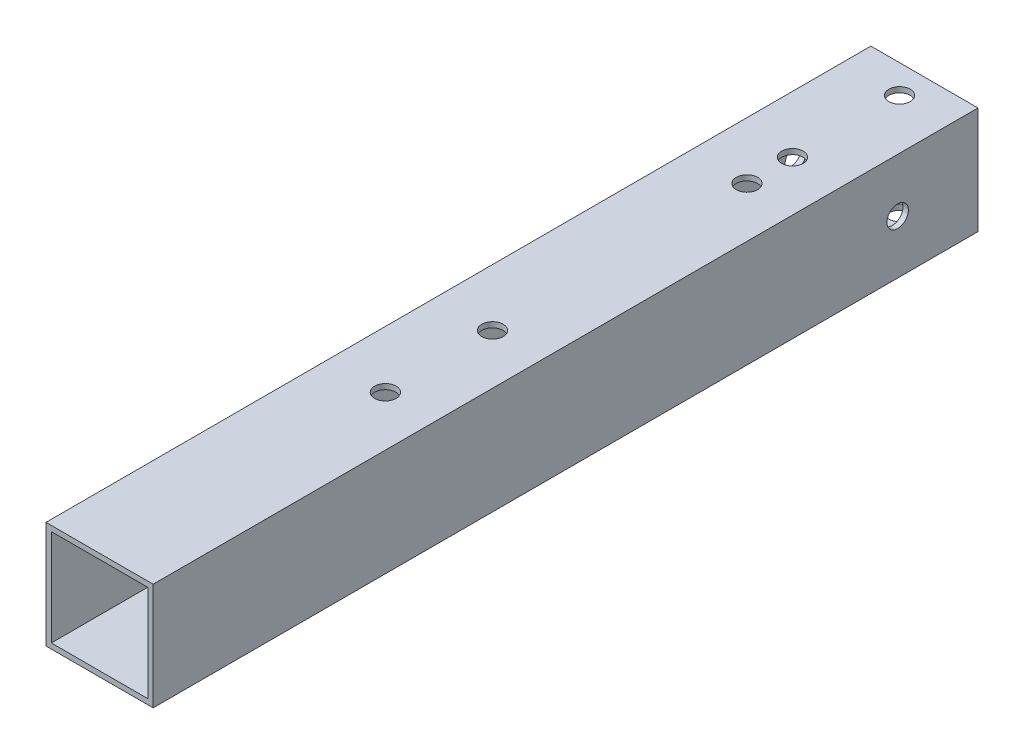
ISO-10303-21;
HEADER;
FILE_DESCRIPTION(('STEP AP214'),'2;1');
FILE_NAME('part.step','',(''),(''),'','','');
FILE_SCHEMA(('AUTOMOTIVE_DESIGN { 1 0 10303 214 1 1 1 1 }'));
ENDSEC;
DATA;
#1=APPLICATION_CONTEXT('core data for automotive mechanical design processes');
#2=APPLICATION_PROTOCOL_DEFINITION('international standard','automotive_design',2000,#1);
#3=PRODUCT_CONTEXT('',#1,'mechanical');
#4=PRODUCT('Part','Part','',(#3));
#5=PRODUCT_RELATED_PRODUCT_CATEGORY('part','',(#4));
#6=PRODUCT_DEFINITION_FORMATION('','',#4);
#7=PRODUCT_DEFINITION_CONTEXT('part definition',#1,'design');
#8=PRODUCT_DEFINITION('design','',#6,#7);
#9=PRODUCT_DEFINITION_SHAPE('','',#8);
#10=(LENGTH_UNIT() NAMED_UNIT(*) SI_UNIT(.MILLI.,.METRE.));
#11=(NAMED_UNIT(*) PLANE_ANGLE_UNIT() SI_UNIT($,.RADIAN.));
#12=(NAMED_UNIT(*) SI_UNIT($,.STERADIAN.) SOLID_ANGLE_UNIT());
#13=UNCERTAINTY_MEASURE_WITH_UNIT(LENGTH_MEASURE(1.E-05),#10,'distance_accuracy_value','');
#14=(GEOMETRIC_REPRESENTATION_CONTEXT(3) GLOBAL_UNCERTAINTY_ASSIGNED_CONTEXT((#13)) GLOBAL_UNIT_ASSIGNED_CONTEXT((#10,
#11,#12)) REPRESENTATION_CONTEXT('',''));
#15=CARTESIAN_POINT('',(0.,0.,0.));
#16=DIRECTION('',(0.,0.,1.));
#17=DIRECTION('',(1.,0.,0.));
#18=AXIS2_PLACEMENT_3D('',#15,#16,#17);
#19=CARTESIAN_POINT('',(0.,0.,83.5));
#20=DIRECTION('',(0.,0.,1.));
#21=DIRECTION('',(1.,0.,0.));
#22=AXIS2_PLACEMENT_3D('',#19,#20,#21);
#23=PLANE('',#22);
#24=DIRECTION('',(0.,1.,0.));
#25=VECTOR('',#24,1.);
#26=CARTESIAN_POINT('',(10.,10.,83.5));
#27=LINE('',#26,#25);
#28=CARTESIAN_POINT('',(10.,-10.,83.5));
#29=VERTEX_POINT('',#28);
#30=CARTESIAN_POINT('',(10.,10.,83.5));
#31=VERTEX_POINT('',#30);
#32=EDGE_CURVE('E205',#29,#31,#27,.T.);
#33=ORIENTED_EDGE('',*,*,#32,.T.);
#34=DIRECTION('',(-1.,0.,0.));
#35=VECTOR('',#34,1.);
#36=CARTESIAN_POINT('',(-10.,10.,83.5));
#37=LINE('',#36,#35);
#38=CARTESIAN_POINT('',(-10.,10.,83.5));
#39=VERTEX_POINT('',#38);
#40=EDGE_CURVE('E209',#31,#39,#37,.T.);
#41=ORIENTED_EDGE('',*,*,#40,.T.);
#42=DIRECTION('',(0.,-1.,0.));
#43=VECTOR('',#42,1.);
#44=CARTESIAN_POINT('',(-10.,10.,83.5));
#45=LINE('',#44,#43);
#46=CARTESIAN_POINT('',(-9.99999999999999,-10.,83.5));
#47=VERTEX_POINT('',#46);
#48=EDGE_CURVE('E127',#39,#47,#45,.T.);
#49=ORIENTED_EDGE('',*,*,#48,.T.);
#50=DIRECTION('',(1.,0.,0.));
#51=VECTOR('',#50,1.);
#52=CARTESIAN_POINT('',(-9.99999999999999,-10.,83.5));
#53=LINE('',#52,#51);
#54=EDGE_CURVE('E214',#47,#29,#53,.T.);
#55=ORIENTED_EDGE('',*,*,#54,.T.);
#56=EDGE_LOOP('',(#33,#41,#49,#55));
#57=FACE_BOUND('',#56,.T.);
#58=DIRECTION('',(-1.,0.,0.));
#59=VECTOR('',#58,1.);
#60=CARTESIAN_POINT('',(-9.00000000000001,9.,83.5));
#61=LINE('',#60,#59);
#62=CARTESIAN_POINT('',(9.,9.,83.5));
#63=VERTEX_POINT('',#62);
#64=CARTESIAN_POINT('',(-9.00000000000001,9.,83.5));
#65=VERTEX_POINT('',#64);
#66=EDGE_CURVE('E179',#63,#65,#61,.T.);
#67=ORIENTED_EDGE('',*,*,#66,.F.);
#68=DIRECTION('',(0.,1.,0.));
#69=VECTOR('',#68,1.);
#70=CARTESIAN_POINT('',(9.,9.,83.5));
#71=LINE('',#70,#69);
#72=CARTESIAN_POINT('',(9.,-9.,83.5));
#73=VERTEX_POINT('',#72);
#74=EDGE_CURVE('E168',#73,#63,#71,.T.);
#75=ORIENTED_EDGE('',*,*,#74,.F.);
#76=DIRECTION('',(1.,0.,0.));
#77=VECTOR('',#76,1.);
#78=CARTESIAN_POINT('',(-9.00000000000001,-9.,83.5));
#79=LINE('',#78,#77);
#80=CARTESIAN_POINT('',(-9.00000000000001,-9.,83.5));
#81=VERTEX_POINT('',#80);
#82=EDGE_CURVE('E186',#81,#73,#79,.T.);
#83=ORIENTED_EDGE('',*,*,#82,.F.);
#84=DIRECTION('',(0.,-1.,0.));
#85=VECTOR('',#84,1.);
#86=CARTESIAN_POINT('',(-9.00000000000001,9.,83.5));
#87=LINE('',#86,#85);
#88=EDGE_CURVE('E182',#65,#81,#87,.T.);
#89=ORIENTED_EDGE('',*,*,#88,.F.);
#90=EDGE_LOOP('',(#67,#75,#83,#89));
#91=FACE_BOUND('',#90,.T.);
#92=ADVANCED_FACE('F42',(#57,#91),#23,.T.);
#93=CARTESIAN_POINT('',(10.,10.,83.5));
#94=DIRECTION('',(-1.,0.,0.));
#95=DIRECTION('',(0.,-1.,0.));
#96=AXIS2_PLACEMENT_3D('',#93,#94,#95);
#97=PLANE('',#96);
#98=CARTESIAN_POINT('',(10.,0.,-55.5));
#99=DIRECTION('',(1.,0.,0.));
#100=DIRECTION('',(0.,1.,0.));
#101=AXIS2_PLACEMENT_3D('',#98,#99,#100);
#102=CIRCLE('',#101,2.);
#103=CARTESIAN_POINT('',(10.,2.,-55.5));
#104=VERTEX_POINT('',#103);
#105=EDGE_CURVE('E546',#104,#104,#102,.T.);
#106=ORIENTED_EDGE('',*,*,#105,.F.);
#107=EDGE_LOOP('',(#106));
#108=FACE_BOUND('',#107,.T.);
#109=DIRECTION('',(0.,0.,-1.));
#110=VECTOR('',#109,1.);
#111=CARTESIAN_POINT('',(10.,-10.,83.5));
#112=LINE('',#111,#110);
#113=CARTESIAN_POINT('',(10.,-10.,-70.4999999999999));
#114=VERTEX_POINT('',#113);
#115=EDGE_CURVE('E134',#29,#114,#112,.T.);
#116=ORIENTED_EDGE('',*,*,#115,.T.);
#117=DIRECTION('',(0.,-1.,0.));
#118=VECTOR('',#117,1.);
#119=CARTESIAN_POINT('',(10.,-10.,-70.5));
#120=LINE('',#119,#118);
#121=CARTESIAN_POINT('',(10.,10.,-70.5));
#122=VERTEX_POINT('',#121);
#123=EDGE_CURVE('E59',#122,#114,#120,.T.);
#124=ORIENTED_EDGE('',*,*,#123,.F.);
#125=DIRECTION('',(0.,0.,-1.));
#126=VECTOR('',#125,1.);
#127=CARTESIAN_POINT('',(10.,10.,83.5));
#128=LINE('',#127,#126);
#129=EDGE_CURVE('E52',#31,#122,#128,.T.);
#130=ORIENTED_EDGE('',*,*,#129,.F.);
#131=ORIENTED_EDGE('',*,*,#32,.F.);
#132=EDGE_LOOP('',(#116,#124,#130,#131));
#133=FACE_BOUND('',#132,.T.);
#134=ADVANCED_FACE('F44',(#108,#133),#97,.F.);
#135=CARTESIAN_POINT('',(-10.,10.,83.5));
#136=DIRECTION('',(0.,-1.,0.));
#137=DIRECTION('',(1.,0.,0.));
#138=AXIS2_PLACEMENT_3D('',#135,#136,#137);
#139=PLANE('',#138);
#140=CARTESIAN_POINT('',(0.645896247201713,10.,30.7887288873649));
#141=DIRECTION('',(0.,1.,0.));
#142=DIRECTION('',(0.,0.,1.));
#143=AXIS2_PLACEMENT_3D('',#140,#141,#142);
#144=CIRCLE('',#143,2.);
#145=CARTESIAN_POINT('',(0.645896247201713,10.,32.7887288873649));
#146=VERTEX_POINT('',#145);
#147=EDGE_CURVE('E237',#146,#146,#144,.T.);
#148=ORIENTED_EDGE('',*,*,#147,.F.);
#149=EDGE_LOOP('',(#148));
#150=FACE_BOUND('',#149,.T.);
#151=CARTESIAN_POINT('',(0.645896247201712,10.,10.7887288873649));
#152=DIRECTION('',(0.,1.,0.));
#153=DIRECTION('',(0.,0.,1.));
#154=AXIS2_PLACEMENT_3D('',#151,#152,#153);
#155=CIRCLE('',#154,2.);
#156=CARTESIAN_POINT('',(0.645896247201712,10.,12.7887288873649));
#157=VERTEX_POINT('',#156);
#158=EDGE_CURVE('E241',#157,#157,#155,.T.);
#159=ORIENTED_EDGE('',*,*,#158,.F.);
#160=EDGE_LOOP('',(#159));
#161=FACE_BOUND('',#160,.T.);
#162=CARTESIAN_POINT('',(0.64589624720171,10.,-36.7112711126351));
#163=DIRECTION('',(0.,1.,0.));
#164=DIRECTION('',(0.,0.,1.));
#165=AXIS2_PLACEMENT_3D('',#162,#163,#164);
#166=CIRCLE('',#165,2.);
#167=CARTESIAN_POINT('',(0.64589624720171,10.,-34.7112711126351));
#168=VERTEX_POINT('',#167);
#169=EDGE_CURVE('E249',#168,#168,#166,.T.);
#170=ORIENTED_EDGE('',*,*,#169,.F.);
#171=EDGE_LOOP('',(#170));
#172=FACE_BOUND('',#171,.T.);
#173=CARTESIAN_POINT('',(0.645896247201709,10.,-45.2112711126351));
#174=DIRECTION('',(0.,1.,0.));
#175=DIRECTION('',(0.,0.,1.));
#176=AXIS2_PLACEMENT_3D('',#173,#174,#175);
#177=CIRCLE('',#176,2.);
#178=CARTESIAN_POINT('',(0.645896247201709,10.,-43.2112711126351));
#179=VERTEX_POINT('',#178);
#180=EDGE_CURVE('E257',#179,#179,#177,.T.);
#181=ORIENTED_EDGE('',*,*,#180,.F.);
#182=EDGE_LOOP('',(#181));
#183=FACE_BOUND('',#182,.T.);
#184=CARTESIAN_POINT('',(0.645896247201708,10.,-65.2112711126351));
#185=DIRECTION('',(0.,1.,0.));
#186=DIRECTION('',(0.,0.,1.));
#187=AXIS2_PLACEMENT_3D('',#184,#185,#186);
#188=CIRCLE('',#187,2.);
#189=CARTESIAN_POINT('',(0.645896247201708,10.,-63.2112711126351));
#190=VERTEX_POINT('',#189);
#191=EDGE_CURVE('E265',#190,#190,#188,.T.);
#192=ORIENTED_EDGE('',*,*,#191,.F.);
#193=EDGE_LOOP('',(#192));
#194=FACE_BOUND('',#193,.T.);
#195=ORIENTED_EDGE('',*,*,#129,.T.);
#196=DIRECTION('',(1.,0.,0.));
#197=VECTOR('',#196,1.);
#198=CARTESIAN_POINT('',(-10.,10.,-70.5));
#199=LINE('',#198,#197);
#200=CARTESIAN_POINT('',(-10.,10.,-70.5));
#201=VERTEX_POINT('',#200);
#202=EDGE_CURVE('E109',#201,#122,#199,.T.);
#203=ORIENTED_EDGE('',*,*,#202,.F.);
#204=DIRECTION('',(0.,0.,-1.));
#205=VECTOR('',#204,1.);
#206=CARTESIAN_POINT('',(-10.,10.,83.5));
#207=LINE('',#206,#205);
#208=EDGE_CURVE('E121',#39,#201,#207,.T.);
#209=ORIENTED_EDGE('',*,*,#208,.F.);
#210=ORIENTED_EDGE('',*,*,#40,.F.);
#211=EDGE_LOOP('',(#195,#203,#209,#210));
#212=FACE_BOUND('',#211,.T.);
#213=ADVANCED_FACE('F120',(#150,#161,#172,#183,#194,#212),#139,.F.);
#214=CARTESIAN_POINT('',(-10.,10.,83.5));
#215=DIRECTION('',(1.,0.,0.));
#216=DIRECTION('',(0.,1.,0.));
#217=AXIS2_PLACEMENT_3D('',#214,#215,#216);
#218=PLANE('',#217);
#219=CARTESIAN_POINT('',(-10.,0.,-55.5));
#220=DIRECTION('',(1.,0.,0.));
#221=DIRECTION('',(0.,1.,0.));
#222=AXIS2_PLACEMENT_3D('',#219,#220,#221);
#223=CIRCLE('',#222,2.);
#224=CARTESIAN_POINT('',(-10.,2.,-55.5));
#225=VERTEX_POINT('',#224);
#226=EDGE_CURVE('E548',#225,#225,#223,.T.);
#227=ORIENTED_EDGE('',*,*,#226,.T.);
#228=EDGE_LOOP('',(#227));
#229=FACE_BOUND('',#228,.T.);
#230=ORIENTED_EDGE('',*,*,#208,.T.);
#231=DIRECTION('',(0.,-1.,0.));
#232=VECTOR('',#231,1.);
#233=CARTESIAN_POINT('',(-10.,-10.,-70.5));
#234=LINE('',#233,#232);
#235=CARTESIAN_POINT('',(-10.,-10.,-70.5));
#236=VERTEX_POINT('',#235);
#237=EDGE_CURVE('E106',#201,#236,#234,.T.);
#238=ORIENTED_EDGE('',*,*,#237,.T.);
#239=DIRECTION('',(0.,0.,-1.));
#240=VECTOR('',#239,1.);
#241=CARTESIAN_POINT('',(-9.99999999999999,-10.,83.5));
#242=LINE('',#241,#240);
#243=EDGE_CURVE('E129',#47,#236,#242,.T.);
#244=ORIENTED_EDGE('',*,*,#243,.F.);
#245=ORIENTED_EDGE('',*,*,#48,.F.);
#246=EDGE_LOOP('',(#230,#238,#244,#245));
#247=FACE_BOUND('',#246,.T.);
#248=ADVANCED_FACE('F126',(#229,#247),#218,.F.);
#249=CARTESIAN_POINT('',(-9.99999999999999,-10.,83.5));
#250=DIRECTION('',(0.,1.,0.));
#251=DIRECTION('',(-1.,0.,0.));
#252=AXIS2_PLACEMENT_3D('',#249,#250,#251);
#253=PLANE('',#252);
#254=CARTESIAN_POINT('',(0.645896247201713,-10.,30.7887288873649));
#255=DIRECTION('',(0.,1.,0.));
#256=DIRECTION('',(0.,0.,1.));
#257=AXIS2_PLACEMENT_3D('',#254,#255,#256);
#258=CIRCLE('',#257,2.);
#259=CARTESIAN_POINT('',(0.645896247201713,-10.,32.7887288873649));
#260=VERTEX_POINT('',#259);
#261=EDGE_CURVE('E143',#260,#260,#258,.T.);
#262=ORIENTED_EDGE('',*,*,#261,.T.);
#263=EDGE_LOOP('',(#262));
#264=FACE_BOUND('',#263,.T.);
#265=CARTESIAN_POINT('',(0.645896247201712,-10.,10.7887288873649));
#266=DIRECTION('',(0.,1.,0.));
#267=DIRECTION('',(0.,0.,1.));
#268=AXIS2_PLACEMENT_3D('',#265,#266,#267);
#269=CIRCLE('',#268,2.);
#270=CARTESIAN_POINT('',(0.645896247201712,-10.,12.7887288873649));
#271=VERTEX_POINT('',#270);
#272=EDGE_CURVE('E245',#271,#271,#269,.T.);
#273=ORIENTED_EDGE('',*,*,#272,.T.);
#274=EDGE_LOOP('',(#273));
#275=FACE_BOUND('',#274,.T.);
#276=CARTESIAN_POINT('',(0.64589624720171,-10.,-36.7112711126351));
#277=DIRECTION('',(0.,1.,0.));
#278=DIRECTION('',(0.,0.,1.));
#279=AXIS2_PLACEMENT_3D('',#276,#277,#278);
#280=CIRCLE('',#279,2.);
#281=CARTESIAN_POINT('',(0.64589624720171,-10.,-34.7112711126351));
#282=VERTEX_POINT('',#281);
#283=EDGE_CURVE('E253',#282,#282,#280,.T.);
#284=ORIENTED_EDGE('',*,*,#283,.T.);
#285=EDGE_LOOP('',(#284));
#286=FACE_BOUND('',#285,.T.);
#287=CARTESIAN_POINT('',(0.645896247201709,-10.,-45.2112711126351));
#288=DIRECTION('',(0.,1.,0.));
#289=DIRECTION('',(0.,0.,1.));
#290=AXIS2_PLACEMENT_3D('',#287,#288,#289);
#291=CIRCLE('',#290,2.);
#292=CARTESIAN_POINT('',(0.645896247201709,-10.,-43.2112711126351));
#293=VERTEX_POINT('',#292);
#294=EDGE_CURVE('E261',#293,#293,#291,.T.);
#295=ORIENTED_EDGE('',*,*,#294,.T.);
#296=EDGE_LOOP('',(#295));
#297=FACE_BOUND('',#296,.T.);
#298=CARTESIAN_POINT('',(0.645896247201708,-10.,-65.2112711126351));
#299=DIRECTION('',(0.,1.,0.));
#300=DIRECTION('',(0.,0.,1.));
#301=AXIS2_PLACEMENT_3D('',#298,#299,#300);
#302=CIRCLE('',#301,2.);
#303=CARTESIAN_POINT('',(0.645896247201708,-10.,-63.2112711126351));
#304=VERTEX_POINT('',#303);
#305=EDGE_CURVE('E236',#304,#304,#302,.T.);
#306=ORIENTED_EDGE('',*,*,#305,.T.);
#307=EDGE_LOOP('',(#306));
#308=FACE_BOUND('',#307,.T.);
#309=ORIENTED_EDGE('',*,*,#243,.T.);
#310=DIRECTION('',(1.,0.,0.));
#311=VECTOR('',#310,1.);
#312=CARTESIAN_POINT('',(-10.,-10.,-70.5));
#313=LINE('',#312,#311);
#314=EDGE_CURVE('E110',#236,#114,#313,.T.);
#315=ORIENTED_EDGE('',*,*,#314,.T.);
#316=ORIENTED_EDGE('',*,*,#115,.F.);
#317=ORIENTED_EDGE('',*,*,#54,.F.);
#318=EDGE_LOOP('',(#309,#315,#316,#317));
#319=FACE_BOUND('',#318,.T.);
#320=ADVANCED_FACE('F223',(#264,#275,#286,#297,#308,#319),#253,.F.);
#321=CARTESIAN_POINT('',(9.,9.,83.5));
#322=DIRECTION('',(-1.,0.,0.));
#323=DIRECTION('',(0.,0.,1.));
#324=AXIS2_PLACEMENT_3D('',#321,#322,#323);
#325=PLANE('',#324);
#326=CARTESIAN_POINT('',(9.,0.,-55.5));
#327=DIRECTION('',(-1.,0.,0.));
#328=DIRECTION('',(0.,0.,1.));
#329=AXIS2_PLACEMENT_3D('',#326,#327,#328);
#330=CIRCLE('',#329,2.);
#331=CARTESIAN_POINT('',(9.,0.,-53.5));
#332=VERTEX_POINT('',#331);
#333=EDGE_CURVE('E543',#332,#332,#330,.T.);
#334=ORIENTED_EDGE('',*,*,#333,.F.);
#335=EDGE_LOOP('',(#334));
#336=FACE_BOUND('',#335,.T.);
#337=DIRECTION('',(0.,1.,0.));
#338=VECTOR('',#337,1.);
#339=CARTESIAN_POINT('',(9.,9.,-70.5));
#340=LINE('',#339,#338);
#341=CARTESIAN_POINT('',(9.,-9.,-70.5));
#342=VERTEX_POINT('',#341);
#343=CARTESIAN_POINT('',(9.,9.,-70.5));
#344=VERTEX_POINT('',#343);
#345=EDGE_CURVE('E233',#342,#344,#340,.T.);
#346=ORIENTED_EDGE('',*,*,#345,.F.);
#347=DIRECTION('',(0.,0.,-1.));
#348=VECTOR('',#347,1.);
#349=CARTESIAN_POINT('',(9.,-9.,83.5));
#350=LINE('',#349,#348);
#351=EDGE_CURVE('E189',#73,#342,#350,.T.);
#352=ORIENTED_EDGE('',*,*,#351,.F.);
#353=ORIENTED_EDGE('',*,*,#74,.T.);
#354=DIRECTION('',(0.,0.,-1.));
#355=VECTOR('',#354,1.);
#356=CARTESIAN_POINT('',(9.,9.,83.5));
#357=LINE('',#356,#355);
#358=EDGE_CURVE('E201',#63,#344,#357,.T.);
#359=ORIENTED_EDGE('',*,*,#358,.T.);
#360=EDGE_LOOP('',(#346,#352,#353,#359));
#361=FACE_BOUND('',#360,.T.);
#362=ADVANCED_FACE('F288',(#336,#361),#325,.T.);
#363=CARTESIAN_POINT('',(-9.00000000000001,9.,83.5));
#364=DIRECTION('',(0.,-1.,0.));
#365=DIRECTION('',(0.,0.,-1.));
#366=AXIS2_PLACEMENT_3D('',#363,#364,#365);
#367=PLANE('',#366);
#368=DIRECTION('',(-1.,0.,0.));
#369=VECTOR('',#368,1.);
#370=CARTESIAN_POINT('',(-9.00000000000001,9.,-70.5));
#371=LINE('',#370,#369);
#372=CARTESIAN_POINT('',(-9.00000000000001,9.,-70.5));
#373=VERTEX_POINT('',#372);
#374=EDGE_CURVE('E227',#344,#373,#371,.T.);
#375=ORIENTED_EDGE('',*,*,#374,.F.);
#376=ORIENTED_EDGE('',*,*,#358,.F.);
#377=ORIENTED_EDGE('',*,*,#66,.T.);
#378=DIRECTION('',(0.,0.,-1.));
#379=VECTOR('',#378,1.);
#380=CARTESIAN_POINT('',(-9.00000000000001,9.,83.5));
#381=LINE('',#380,#379);
#382=EDGE_CURVE('E197',#65,#373,#381,.T.);
#383=ORIENTED_EDGE('',*,*,#382,.T.);
#384=EDGE_LOOP('',(#375,#376,#377,#383));
#385=FACE_BOUND('',#384,.T.);
#386=CARTESIAN_POINT('',(0.645896247201713,9.,30.7887288873649));
#387=DIRECTION('',(0.,-1.,0.));
#388=DIRECTION('',(0.,0.,-1.));
#389=AXIS2_PLACEMENT_3D('',#386,#387,#388);
#390=CIRCLE('',#389,2.);
#391=CARTESIAN_POINT('',(0.645896247201713,9.,28.7887288873649));
#392=VERTEX_POINT('',#391);
#393=EDGE_CURVE('E162',#392,#392,#390,.T.);
#394=ORIENTED_EDGE('',*,*,#393,.F.);
#395=EDGE_LOOP('',(#394));
#396=FACE_BOUND('',#395,.T.);
#397=CARTESIAN_POINT('',(0.645896247201712,9.,10.7887288873649));
#398=DIRECTION('',(0.,-1.,0.));
#399=DIRECTION('',(0.,0.,-1.));
#400=AXIS2_PLACEMENT_3D('',#397,#398,#399);
#401=CIRCLE('',#400,2.);
#402=CARTESIAN_POINT('',(0.645896247201712,9.,8.78872888736491));
#403=VERTEX_POINT('',#402);
#404=EDGE_CURVE('E158',#403,#403,#401,.T.);
#405=ORIENTED_EDGE('',*,*,#404,.F.);
#406=EDGE_LOOP('',(#405));
#407=FACE_BOUND('',#406,.T.);
#408=CARTESIAN_POINT('',(0.64589624720171,9.,-36.7112711126351));
#409=DIRECTION('',(0.,-1.,0.));
#410=DIRECTION('',(0.,0.,-1.));
#411=AXIS2_PLACEMENT_3D('',#408,#409,#410);
#412=CIRCLE('',#411,2.);
#413=CARTESIAN_POINT('',(0.64589624720171,9.,-38.7112711126351));
#414=VERTEX_POINT('',#413);
#415=EDGE_CURVE('E153',#414,#414,#412,.T.);
#416=ORIENTED_EDGE('',*,*,#415,.F.);
#417=EDGE_LOOP('',(#416));
#418=FACE_BOUND('',#417,.T.);
#419=CARTESIAN_POINT('',(0.645896247201709,9.,-45.2112711126351));
#420=DIRECTION('',(0.,-1.,0.));
#421=DIRECTION('',(0.,0.,-1.));
#422=AXIS2_PLACEMENT_3D('',#419,#420,#421);
#423=CIRCLE('',#422,2.);
#424=CARTESIAN_POINT('',(0.645896247201709,9.,-47.2112711126351));
#425=VERTEX_POINT('',#424);
#426=EDGE_CURVE('E148',#425,#425,#423,.T.);
#427=ORIENTED_EDGE('',*,*,#426,.F.);
#428=EDGE_LOOP('',(#427));
#429=FACE_BOUND('',#428,.T.);
#430=CARTESIAN_POINT('',(0.645896247201708,9.,-65.2112711126351));
#431=DIRECTION('',(0.,-1.,0.));
#432=DIRECTION('',(0.,0.,-1.));
#433=AXIS2_PLACEMENT_3D('',#430,#431,#432);
#434=CIRCLE('',#433,2.);
#435=CARTESIAN_POINT('',(0.645896247201708,9.,-67.2112711126351));
#436=VERTEX_POINT('',#435);
#437=EDGE_CURVE('E142',#436,#436,#434,.T.);
#438=ORIENTED_EDGE('',*,*,#437,.F.);
#439=EDGE_LOOP('',(#438));
#440=FACE_BOUND('',#439,.T.);
#441=ADVANCED_FACE('F284',(#385,#396,#407,#418,#429,#440),#367,.T.);
#442=CARTESIAN_POINT('',(-9.00000000000001,9.,83.5));
#443=DIRECTION('',(1.,0.,0.));
#444=DIRECTION('',(0.,1.,0.));
#445=AXIS2_PLACEMENT_3D('',#442,#443,#444);
#446=PLANE('',#445);
#447=CARTESIAN_POINT('',(-9.00000000000001,0.,-55.5));
#448=DIRECTION('',(1.,0.,0.));
#449=DIRECTION('',(0.,1.,0.));
#450=AXIS2_PLACEMENT_3D('',#447,#448,#449);
#451=CIRCLE('',#450,2.);
#452=CARTESIAN_POINT('',(-9.00000000000001,2.,-55.5));
#453=VERTEX_POINT('',#452);
#454=EDGE_CURVE('E46',#453,#453,#451,.T.);
#455=ORIENTED_EDGE('',*,*,#454,.F.);
#456=EDGE_LOOP('',(#455));
#457=FACE_BOUND('',#456,.T.);
#458=DIRECTION('',(0.,-1.,0.));
#459=VECTOR('',#458,1.);
#460=CARTESIAN_POINT('',(-9.00000000000001,9.,-70.5));
#461=LINE('',#460,#459);
#462=CARTESIAN_POINT('',(-9.00000000000001,-9.,-70.5));
#463=VERTEX_POINT('',#462);
#464=EDGE_CURVE('E66',#373,#463,#461,.T.);
#465=ORIENTED_EDGE('',*,*,#464,.F.);
#466=ORIENTED_EDGE('',*,*,#382,.F.);
#467=ORIENTED_EDGE('',*,*,#88,.T.);
#468=DIRECTION('',(0.,0.,-1.));
#469=VECTOR('',#468,1.);
#470=CARTESIAN_POINT('',(-9.00000000000001,-9.,83.5));
#471=LINE('',#470,#469);
#472=EDGE_CURVE('E193',#81,#463,#471,.T.);
#473=ORIENTED_EDGE('',*,*,#472,.T.);
#474=EDGE_LOOP('',(#465,#466,#467,#473));
#475=FACE_BOUND('',#474,.T.);
#476=ADVANCED_FACE('F287',(#457,#475),#446,.T.);
#477=CARTESIAN_POINT('',(-9.00000000000001,-9.,83.5));
#478=DIRECTION('',(0.,1.,0.));
#479=DIRECTION('',(-1.,0.,0.));
#480=AXIS2_PLACEMENT_3D('',#477,#478,#479);
#481=PLANE('',#480);
#482=DIRECTION('',(1.,0.,0.));
#483=VECTOR('',#482,1.);
#484=CARTESIAN_POINT('',(-9.00000000000001,-9.,-70.5));
#485=LINE('',#484,#483);
#486=EDGE_CURVE('E11',#463,#342,#485,.T.);
#487=ORIENTED_EDGE('',*,*,#486,.F.);
#488=ORIENTED_EDGE('',*,*,#472,.F.);
#489=ORIENTED_EDGE('',*,*,#82,.T.);
#490=ORIENTED_EDGE('',*,*,#351,.T.);
#491=EDGE_LOOP('',(#487,#488,#489,#490));
#492=FACE_BOUND('',#491,.T.);
#493=CARTESIAN_POINT('',(0.645896247201713,-9.,30.7887288873649));
#494=DIRECTION('',(0.,1.,0.));
#495=DIRECTION('',(-1.,0.,0.));
#496=AXIS2_PLACEMENT_3D('',#493,#494,#495);
#497=CIRCLE('',#496,2.);
#498=CARTESIAN_POINT('',(-1.35410375279829,-9.,30.7887288873649));
#499=VERTEX_POINT('',#498);
#500=EDGE_CURVE('E159',#499,#499,#497,.T.);
#501=ORIENTED_EDGE('',*,*,#500,.F.);
#502=EDGE_LOOP('',(#501));
#503=FACE_BOUND('',#502,.T.);
#504=CARTESIAN_POINT('',(0.645896247201712,-9.,10.7887288873649));
#505=DIRECTION('',(0.,1.,0.));
#506=DIRECTION('',(-1.,0.,0.));
#507=AXIS2_PLACEMENT_3D('',#504,#505,#506);
#508=CIRCLE('',#507,2.);
#509=CARTESIAN_POINT('',(-1.35410375279829,-9.,10.7887288873649));
#510=VERTEX_POINT('',#509);
#511=EDGE_CURVE('E154',#510,#510,#508,.T.);
#512=ORIENTED_EDGE('',*,*,#511,.F.);
#513=EDGE_LOOP('',(#512));
#514=FACE_BOUND('',#513,.T.);
#515=CARTESIAN_POINT('',(0.64589624720171,-9.,-36.7112711126351));
#516=DIRECTION('',(0.,1.,0.));
#517=DIRECTION('',(-1.,0.,0.));
#518=AXIS2_PLACEMENT_3D('',#515,#516,#517);
#519=CIRCLE('',#518,2.);
#520=CARTESIAN_POINT('',(-1.35410375279829,-9.,-36.7112711126351));
#521=VERTEX_POINT('',#520);
#522=EDGE_CURVE('E149',#521,#521,#519,.T.);
#523=ORIENTED_EDGE('',*,*,#522,.F.);
#524=EDGE_LOOP('',(#523));
#525=FACE_BOUND('',#524,.T.);
#526=CARTESIAN_POINT('',(0.645896247201709,-9.,-45.2112711126351));
#527=DIRECTION('',(0.,1.,0.));
#528=DIRECTION('',(-1.,0.,0.));
#529=AXIS2_PLACEMENT_3D('',#526,#527,#528);
#530=CIRCLE('',#529,2.);
#531=CARTESIAN_POINT('',(-1.35410375279829,-9.,-45.2112711126351));
#532=VERTEX_POINT('',#531);
#533=EDGE_CURVE('E144',#532,#532,#530,.T.);
#534=ORIENTED_EDGE('',*,*,#533,.F.);
#535=EDGE_LOOP('',(#534));
#536=FACE_BOUND('',#535,.T.);
#537=CARTESIAN_POINT('',(0.645896247201708,-9.,-65.2112711126351));
#538=DIRECTION('',(0.,1.,0.));
#539=DIRECTION('',(-1.,0.,0.));
#540=AXIS2_PLACEMENT_3D('',#537,#538,#539);
#541=CIRCLE('',#540,2.);
#542=CARTESIAN_POINT('',(-1.35410375279829,-9.,-65.2112711126351));
#543=VERTEX_POINT('',#542);
#544=EDGE_CURVE('E138',#543,#543,#541,.T.);
#545=ORIENTED_EDGE('',*,*,#544,.F.);
#546=EDGE_LOOP('',(#545));
#547=FACE_BOUND('',#546,.T.);
#548=ADVANCED_FACE('F340',(#492,#503,#514,#525,#536,#547),#481,.T.);
#549=CARTESIAN_POINT('',(0.645896247201708,-10.,-65.2112711126351));
#550=DIRECTION('',(0.,1.,0.));
#551=DIRECTION('',(0.,0.,1.));
#552=AXIS2_PLACEMENT_3D('',#549,#550,#551);
#553=CYLINDRICAL_SURFACE('',#552,2.);
#554=ORIENTED_EDGE('',*,*,#544,.T.);
#555=EDGE_LOOP('',(#554));
#556=FACE_BOUND('',#555,.T.);
#557=ORIENTED_EDGE('',*,*,#305,.F.);
#558=EDGE_LOOP('',(#557));
#559=FACE_BOUND('',#558,.T.);
#560=ADVANCED_FACE('F298',(#556,#559),#553,.F.);
#561=CARTESIAN_POINT('',(0.645896247201709,-10.,-45.2112711126351));
#562=DIRECTION('',(0.,1.,0.));
#563=DIRECTION('',(0.,0.,1.));
#564=AXIS2_PLACEMENT_3D('',#561,#562,#563);
#565=CYLINDRICAL_SURFACE('',#564,2.);
#566=ORIENTED_EDGE('',*,*,#533,.T.);
#567=EDGE_LOOP('',(#566));
#568=FACE_BOUND('',#567,.T.);
#569=ORIENTED_EDGE('',*,*,#294,.F.);
#570=EDGE_LOOP('',(#569));
#571=FACE_BOUND('',#570,.T.);
#572=ADVANCED_FACE('F339',(#568,#571),#565,.F.);
#573=CARTESIAN_POINT('',(0.64589624720171,-10.,-36.7112711126351));
#574=DIRECTION('',(0.,1.,0.));
#575=DIRECTION('',(0.,0.,1.));
#576=AXIS2_PLACEMENT_3D('',#573,#574,#575);
#577=CYLINDRICAL_SURFACE('',#576,2.);
#578=ORIENTED_EDGE('',*,*,#522,.T.);
#579=EDGE_LOOP('',(#578));
#580=FACE_BOUND('',#579,.T.);
#581=ORIENTED_EDGE('',*,*,#283,.F.);
#582=EDGE_LOOP('',(#581));
#583=FACE_BOUND('',#582,.T.);
#584=ADVANCED_FACE('F346',(#580,#583),#577,.F.);
#585=CARTESIAN_POINT('',(0.645896247201712,-10.,10.7887288873649));
#586=DIRECTION('',(0.,1.,0.));
#587=DIRECTION('',(0.,0.,1.));
#588=AXIS2_PLACEMENT_3D('',#585,#586,#587);
#589=CYLINDRICAL_SURFACE('',#588,2.);
#590=ORIENTED_EDGE('',*,*,#511,.T.);
#591=EDGE_LOOP('',(#590));
#592=FACE_BOUND('',#591,.T.);
#593=ORIENTED_EDGE('',*,*,#272,.F.);
#594=EDGE_LOOP('',(#593));
#595=FACE_BOUND('',#594,.T.);
#596=ADVANCED_FACE('F390',(#592,#595),#589,.F.);
#597=CARTESIAN_POINT('',(0.645896247201713,-10.,30.7887288873649));
#598=DIRECTION('',(0.,1.,0.));
#599=DIRECTION('',(0.,0.,1.));
#600=AXIS2_PLACEMENT_3D('',#597,#598,#599);
#601=CYLINDRICAL_SURFACE('',#600,2.);
#602=ORIENTED_EDGE('',*,*,#500,.T.);
#603=EDGE_LOOP('',(#602));
#604=FACE_BOUND('',#603,.T.);
#605=ORIENTED_EDGE('',*,*,#261,.F.);
#606=EDGE_LOOP('',(#605));
#607=FACE_BOUND('',#606,.T.);
#608=ADVANCED_FACE('F296',(#604,#607),#601,.F.);
#609=ORIENTED_EDGE('',*,*,#437,.T.);
#610=EDGE_LOOP('',(#609));
#611=FACE_BOUND('',#610,.T.);
#612=ORIENTED_EDGE('',*,*,#191,.T.);
#613=EDGE_LOOP('',(#612));
#614=FACE_BOUND('',#613,.T.);
#615=ADVANCED_FACE('F293',(#611,#614),#553,.F.);
#616=ORIENTED_EDGE('',*,*,#426,.T.);
#617=EDGE_LOOP('',(#616));
#618=FACE_BOUND('',#617,.T.);
#619=ORIENTED_EDGE('',*,*,#180,.T.);
#620=EDGE_LOOP('',(#619));
#621=FACE_BOUND('',#620,.T.);
#622=ADVANCED_FACE('F281',(#618,#621),#565,.F.);
#623=ORIENTED_EDGE('',*,*,#415,.T.);
#624=EDGE_LOOP('',(#623));
#625=FACE_BOUND('',#624,.T.);
#626=ORIENTED_EDGE('',*,*,#169,.T.);
#627=EDGE_LOOP('',(#626));
#628=FACE_BOUND('',#627,.T.);
#629=ADVANCED_FACE('F395',(#625,#628),#577,.F.);
#630=ORIENTED_EDGE('',*,*,#404,.T.);
#631=EDGE_LOOP('',(#630));
#632=FACE_BOUND('',#631,.T.);
#633=ORIENTED_EDGE('',*,*,#158,.T.);
#634=EDGE_LOOP('',(#633));
#635=FACE_BOUND('',#634,.T.);
#636=ADVANCED_FACE('F385',(#632,#635),#589,.F.);
#637=ORIENTED_EDGE('',*,*,#393,.T.);
#638=EDGE_LOOP('',(#637));
#639=FACE_BOUND('',#638,.T.);
#640=ORIENTED_EDGE('',*,*,#147,.T.);
#641=EDGE_LOOP('',(#640));
#642=FACE_BOUND('',#641,.T.);
#643=ADVANCED_FACE('F376',(#639,#642),#601,.F.);
#644=CARTESIAN_POINT('',(-10.,-10.,-70.5));
#645=DIRECTION('',(0.,0.,1.));
#646=DIRECTION('',(1.,0.,0.));
#647=AXIS2_PLACEMENT_3D('',#644,#645,#646);
#648=PLANE('',#647);
#649=ORIENTED_EDGE('',*,*,#345,.T.);
#650=ORIENTED_EDGE('',*,*,#374,.T.);
#651=ORIENTED_EDGE('',*,*,#464,.T.);
#652=ORIENTED_EDGE('',*,*,#486,.T.);
#653=EDGE_LOOP('',(#649,#650,#651,#652));
#654=FACE_BOUND('',#653,.T.);
#655=ORIENTED_EDGE('',*,*,#123,.T.);
#656=ORIENTED_EDGE('',*,*,#314,.F.);
#657=ORIENTED_EDGE('',*,*,#237,.F.);
#658=ORIENTED_EDGE('',*,*,#202,.T.);
#659=EDGE_LOOP('',(#655,#656,#657,#658));
#660=FACE_BOUND('',#659,.T.);
#661=ADVANCED_FACE('F108',(#654,#660),#648,.F.);
#662=CARTESIAN_POINT('',(-10.,0.,-55.5));
#663=DIRECTION('',(1.,0.,0.));
#664=DIRECTION('',(0.,1.,0.));
#665=AXIS2_PLACEMENT_3D('',#662,#663,#664);
#666=CYLINDRICAL_SURFACE('',#665,2.);
#667=ORIENTED_EDGE('',*,*,#454,.T.);
#668=EDGE_LOOP('',(#667));
#669=FACE_BOUND('',#668,.T.);
#670=ORIENTED_EDGE('',*,*,#226,.F.);
#671=EDGE_LOOP('',(#670));
#672=FACE_BOUND('',#671,.T.);
#673=ADVANCED_FACE('F375',(#669,#672),#666,.F.);
#674=ORIENTED_EDGE('',*,*,#333,.T.);
#675=EDGE_LOOP('',(#674));
#676=FACE_BOUND('',#675,.T.);
#677=ORIENTED_EDGE('',*,*,#105,.T.);
#678=EDGE_LOOP('',(#677));
#679=FACE_BOUND('',#678,.T.);
#680=ADVANCED_FACE('F382',(#676,#679),#666,.F.);
#681=CLOSED_SHELL('',(#92,#134,#213,#248,#320,#362,#441,#476,#548,#560,#572,#584,#596,#608,#615,
#622,#629,#636,#643,#661,#673,#680));
#682=MANIFOLD_SOLID_BREP('B2',#681);
#683=ADVANCED_BREP_SHAPE_REPRESENTATION('',(#18,#682),#14);
#684=SHAPE_DEFINITION_REPRESENTATION(#9,#683);
ENDSEC;
END-ISO-10303-21;
